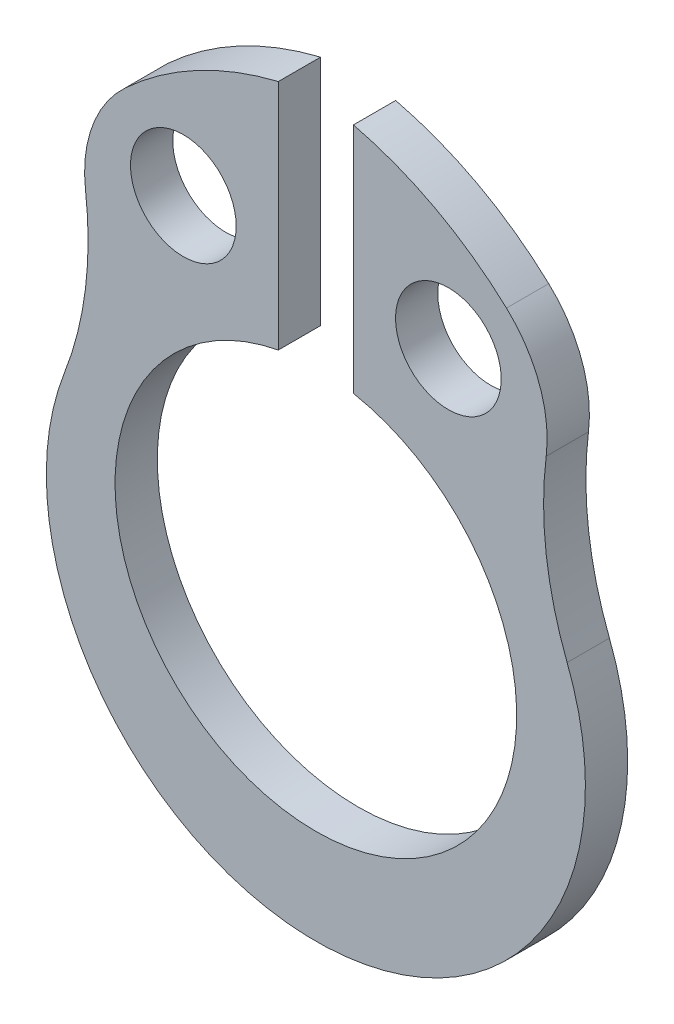
ISO-10303-21;
HEADER;
FILE_DESCRIPTION(('STEP AP214'),'2;1');
FILE_NAME('part.step','',(''),(''),'','','');
FILE_SCHEMA(('AUTOMOTIVE_DESIGN { 1 0 10303 214 1 1 1 1 }'));
ENDSEC;
DATA;
#1=APPLICATION_CONTEXT('core data for automotive mechanical design processes');
#2=APPLICATION_PROTOCOL_DEFINITION('international standard','automotive_design',2000,#1);
#3=PRODUCT_CONTEXT('',#1,'mechanical');
#4=PRODUCT('Part','Part','',(#3));
#5=PRODUCT_RELATED_PRODUCT_CATEGORY('part','',(#4));
#6=PRODUCT_DEFINITION_FORMATION('','',#4);
#7=PRODUCT_DEFINITION_CONTEXT('part definition',#1,'design');
#8=PRODUCT_DEFINITION('design','',#6,#7);
#9=PRODUCT_DEFINITION_SHAPE('','',#8);
#10=(LENGTH_UNIT() NAMED_UNIT(*) SI_UNIT(.MILLI.,.METRE.));
#11=(NAMED_UNIT(*) PLANE_ANGLE_UNIT() SI_UNIT($,.RADIAN.));
#12=(NAMED_UNIT(*) SI_UNIT($,.STERADIAN.) SOLID_ANGLE_UNIT());
#13=UNCERTAINTY_MEASURE_WITH_UNIT(LENGTH_MEASURE(1.E-05),#10,'distance_accuracy_value','');
#14=(GEOMETRIC_REPRESENTATION_CONTEXT(3) GLOBAL_UNCERTAINTY_ASSIGNED_CONTEXT((#13)) GLOBAL_UNIT_ASSIGNED_CONTEXT((#10,
#11,#12)) REPRESENTATION_CONTEXT('',''));
#15=CARTESIAN_POINT('',(0.,0.,0.));
#16=DIRECTION('',(0.,0.,1.));
#17=DIRECTION('',(1.,0.,0.));
#18=AXIS2_PLACEMENT_3D('',#15,#16,#17);
#19=CARTESIAN_POINT('',(-0.414589589053333,0.892839871271795,0.2));
#20=DIRECTION('',(0.,0.,-1.));
#21=DIRECTION('',(-1.,0.,0.));
#22=AXIS2_PLACEMENT_3D('',#19,#20,#21);
#23=PLANE('',#22);
#24=CARTESIAN_POINT('',(-0.414589589053333,0.892839871271795,0.2));
#25=DIRECTION('',(0.,0.,1.));
#26=DIRECTION('',(-1.,0.,0.));
#27=AXIS2_PLACEMENT_3D('',#24,#25,#26);
#28=CIRCLE('',#27,3.26568603204113);
#29=CARTESIAN_POINT('',(1.80338404953109,3.28977503902522,0.2));
#30=VERTEX_POINT('',#29);
#31=CARTESIAN_POINT('',(0.355177162860174,4.066507214822,0.2));
#32=VERTEX_POINT('',#31);
#33=EDGE_CURVE('E163',#30,#32,#28,.T.);
#34=ORIENTED_EDGE('',*,*,#33,.T.);
#35=DIRECTION('',(0.,-1.,0.));
#36=VECTOR('',#35,1.);
#37=CARTESIAN_POINT('',(0.355177162860174,4.066507214822,0.2));
#38=LINE('',#37,#36);
#39=CARTESIAN_POINT('',(0.355177162860174,1.866507214822,0.2));
#40=VERTEX_POINT('',#39);
#41=EDGE_CURVE('E101',#32,#40,#38,.T.);
#42=ORIENTED_EDGE('',*,*,#41,.T.);
#43=CARTESIAN_POINT('',(0.,0.,0.2));
#44=DIRECTION('',(0.,0.,-1.));
#45=DIRECTION('',(1.,0.,0.));
#46=AXIS2_PLACEMENT_3D('',#43,#44,#45);
#47=CIRCLE('',#46,1.9);
#48=CARTESIAN_POINT('',(-0.355177162860174,1.866507214822,0.2));
#49=VERTEX_POINT('',#48);
#50=EDGE_CURVE('E184',#40,#49,#47,.T.);
#51=ORIENTED_EDGE('',*,*,#50,.T.);
#52=DIRECTION('',(0.,1.,0.));
#53=VECTOR('',#52,1.);
#54=CARTESIAN_POINT('',(-0.355177162860174,4.066507214822,0.2));
#55=LINE('',#54,#53);
#56=CARTESIAN_POINT('',(-0.355177162860174,4.066507214822,0.2));
#57=VERTEX_POINT('',#56);
#58=EDGE_CURVE('E203',#49,#57,#55,.T.);
#59=ORIENTED_EDGE('',*,*,#58,.T.);
#60=CARTESIAN_POINT('',(0.414589589060315,0.892839871271795,0.2));
#61=DIRECTION('',(0.,0.,1.));
#62=DIRECTION('',(1.,0.,0.));
#63=AXIS2_PLACEMENT_3D('',#60,#61,#62);
#64=CIRCLE('',#63,3.26568603204195);
#65=CARTESIAN_POINT('',(-1.80338404952466,3.28977503902582,0.2));
#66=VERTEX_POINT('',#65);
#67=EDGE_CURVE('E200',#57,#66,#64,.T.);
#68=ORIENTED_EDGE('',*,*,#67,.T.);
#69=CARTESIAN_POINT('',(-0.98906064981131,2.40974636747533,0.2));
#70=DIRECTION('',(0.,0.,1.));
#71=DIRECTION('',(1.,0.,0.));
#72=AXIS2_PLACEMENT_3D('',#69,#70,#71);
#73=CIRCLE('',#72,1.19898834943033);
#74=CARTESIAN_POINT('',(-2.17908467622791,2.26340471714679,0.2));
#75=VERTEX_POINT('',#74);
#76=EDGE_CURVE('E202',#66,#75,#73,.T.);
#77=ORIENTED_EDGE('',*,*,#76,.T.);
#78=CARTESIAN_POINT('',(-5.44214854728816,1.86213369957221,0.2));
#79=DIRECTION('',(0.,0.,-1.));
#80=DIRECTION('',(-1.,0.,0.));
#81=AXIS2_PLACEMENT_3D('',#78,#79,#80);
#82=CIRCLE('',#81,3.28764418028533);
#83=CARTESIAN_POINT('',(-2.37723957935828,0.672622340035446,0.2));
#84=VERTEX_POINT('',#83);
#85=EDGE_CURVE('E126',#75,#84,#82,.T.);
#86=ORIENTED_EDGE('',*,*,#85,.T.);
#87=CARTESIAN_POINT('',(0.,-0.25,0.2));
#88=DIRECTION('',(0.,0.,1.));
#89=DIRECTION('',(1.,0.,0.));
#90=AXIS2_PLACEMENT_3D('',#87,#88,#89);
#91=CIRCLE('',#90,2.55);
#92=CARTESIAN_POINT('',(2.37723957935828,0.672622340035446,0.2));
#93=VERTEX_POINT('',#92);
#94=EDGE_CURVE('E120',#84,#93,#91,.T.);
#95=ORIENTED_EDGE('',*,*,#94,.T.);
#96=CARTESIAN_POINT('',(5.44214854728816,1.86213369957221,0.2));
#97=DIRECTION('',(0.,0.,-1.));
#98=DIRECTION('',(1.,0.,0.));
#99=AXIS2_PLACEMENT_3D('',#96,#97,#98);
#100=CIRCLE('',#99,3.28764418028186);
#101=CARTESIAN_POINT('',(2.17908467623146,2.26340471714721,0.2));
#102=VERTEX_POINT('',#101);
#103=EDGE_CURVE('E124',#93,#102,#100,.T.);
#104=ORIENTED_EDGE('',*,*,#103,.T.);
#105=CARTESIAN_POINT('',(0.989060649818293,2.40974636747533,0.2));
#106=DIRECTION('',(0.,0.,1.));
#107=DIRECTION('',(-1.,0.,0.));
#108=AXIS2_PLACEMENT_3D('',#105,#106,#107);
#109=CIRCLE('',#108,1.19898834943033);
#110=EDGE_CURVE('E52',#102,#30,#109,.T.);
#111=ORIENTED_EDGE('',*,*,#110,.T.);
#112=EDGE_LOOP('',(#34,#42,#51,#59,#68,#77,#86,#95,#104,#111));
#113=FACE_BOUND('',#112,.T.);
#114=CARTESIAN_POINT('',(-1.25367320500997,2.68221999934888,0.2));
#115=DIRECTION('',(0.,0.,1.));
#116=DIRECTION('',(1.,0.,0.));
#117=AXIS2_PLACEMENT_3D('',#114,#115,#116);
#118=CIRCLE('',#117,0.5);
#119=CARTESIAN_POINT('',(-0.753673205009974,2.68221999934888,0.2));
#120=VERTEX_POINT('',#119);
#121=EDGE_CURVE('E148',#120,#120,#118,.T.);
#122=ORIENTED_EDGE('',*,*,#121,.F.);
#123=EDGE_LOOP('',(#122));
#124=FACE_BOUND('',#123,.T.);
#125=CARTESIAN_POINT('',(1.25367320501696,2.68221999934888,0.2));
#126=DIRECTION('',(0.,0.,1.));
#127=DIRECTION('',(-1.,0.,0.));
#128=AXIS2_PLACEMENT_3D('',#125,#126,#127);
#129=CIRCLE('',#128,0.5);
#130=CARTESIAN_POINT('',(0.753673205016958,2.68221999934888,0.2));
#131=VERTEX_POINT('',#130);
#132=EDGE_CURVE('E214',#131,#131,#129,.T.);
#133=ORIENTED_EDGE('',*,*,#132,.F.);
#134=EDGE_LOOP('',(#133));
#135=FACE_BOUND('',#134,.T.);
#136=ADVANCED_FACE('F35',(#113,#124,#135),#23,.F.);
#137=CARTESIAN_POINT('',(-0.414589589053333,0.892839871271795,-0.2));
#138=DIRECTION('',(0.,0.,-1.));
#139=DIRECTION('',(-1.,0.,0.));
#140=AXIS2_PLACEMENT_3D('',#137,#138,#139);
#141=PLANE('',#140);
#142=CARTESIAN_POINT('',(-1.25367320500997,2.68221999934888,-0.2));
#143=DIRECTION('',(0.,0.,1.));
#144=DIRECTION('',(1.,0.,0.));
#145=AXIS2_PLACEMENT_3D('',#142,#143,#144);
#146=CIRCLE('',#145,0.5);
#147=CARTESIAN_POINT('',(-0.753673205009974,2.68221999934888,-0.2));
#148=VERTEX_POINT('',#147);
#149=EDGE_CURVE('E211',#148,#148,#146,.T.);
#150=ORIENTED_EDGE('',*,*,#149,.T.);
#151=EDGE_LOOP('',(#150));
#152=FACE_BOUND('',#151,.T.);
#153=CARTESIAN_POINT('',(-0.414589589053333,0.892839871271795,-0.2));
#154=DIRECTION('',(0.,0.,1.));
#155=DIRECTION('',(-1.,0.,0.));
#156=AXIS2_PLACEMENT_3D('',#153,#154,#155);
#157=CIRCLE('',#156,3.26568603204113);
#158=CARTESIAN_POINT('',(1.80338404953109,3.28977503902522,-0.2));
#159=VERTEX_POINT('',#158);
#160=CARTESIAN_POINT('',(0.355177162860174,4.066507214822,-0.2));
#161=VERTEX_POINT('',#160);
#162=EDGE_CURVE('E144',#159,#161,#157,.T.);
#163=ORIENTED_EDGE('',*,*,#162,.F.);
#164=CARTESIAN_POINT('',(0.989060649818293,2.40974636747533,-0.2));
#165=DIRECTION('',(0.,0.,1.));
#166=DIRECTION('',(-1.,0.,0.));
#167=AXIS2_PLACEMENT_3D('',#164,#165,#166);
#168=CIRCLE('',#167,1.19898834943033);
#169=CARTESIAN_POINT('',(2.17908467623146,2.26340471714721,-0.2));
#170=VERTEX_POINT('',#169);
#171=EDGE_CURVE('E93',#170,#159,#168,.T.);
#172=ORIENTED_EDGE('',*,*,#171,.F.);
#173=CARTESIAN_POINT('',(5.44214854728816,1.86213369957221,-0.2));
#174=DIRECTION('',(0.,0.,-1.));
#175=DIRECTION('',(1.,0.,0.));
#176=AXIS2_PLACEMENT_3D('',#173,#174,#175);
#177=CIRCLE('',#176,3.28764418028186);
#178=CARTESIAN_POINT('',(2.37723957935828,0.672622340035446,-0.2));
#179=VERTEX_POINT('',#178);
#180=EDGE_CURVE('E87',#179,#170,#177,.T.);
#181=ORIENTED_EDGE('',*,*,#180,.F.);
#182=CARTESIAN_POINT('',(0.,-0.25,-0.2));
#183=DIRECTION('',(0.,0.,1.));
#184=DIRECTION('',(1.,0.,0.));
#185=AXIS2_PLACEMENT_3D('',#182,#183,#184);
#186=CIRCLE('',#185,2.55);
#187=CARTESIAN_POINT('',(-2.37723957935828,0.672622340035446,-0.2));
#188=VERTEX_POINT('',#187);
#189=EDGE_CURVE('E134',#188,#179,#186,.T.);
#190=ORIENTED_EDGE('',*,*,#189,.F.);
#191=CARTESIAN_POINT('',(-5.44214854728816,1.86213369957221,-0.2));
#192=DIRECTION('',(0.,0.,-1.));
#193=DIRECTION('',(-1.,0.,0.));
#194=AXIS2_PLACEMENT_3D('',#191,#192,#193);
#195=CIRCLE('',#194,3.28764418028533);
#196=CARTESIAN_POINT('',(-2.17908467622791,2.26340471714679,-0.2));
#197=VERTEX_POINT('',#196);
#198=EDGE_CURVE('E158',#197,#188,#195,.T.);
#199=ORIENTED_EDGE('',*,*,#198,.F.);
#200=CARTESIAN_POINT('',(-0.98906064981131,2.40974636747533,-0.2));
#201=DIRECTION('',(0.,0.,1.));
#202=DIRECTION('',(1.,0.,0.));
#203=AXIS2_PLACEMENT_3D('',#200,#201,#202);
#204=CIRCLE('',#203,1.19898834943033);
#205=CARTESIAN_POINT('',(-1.80338404952466,3.28977503902582,-0.2));
#206=VERTEX_POINT('',#205);
#207=EDGE_CURVE('E156',#206,#197,#204,.T.);
#208=ORIENTED_EDGE('',*,*,#207,.F.);
#209=CARTESIAN_POINT('',(0.414589589060315,0.892839871271795,-0.2));
#210=DIRECTION('',(0.,0.,1.));
#211=DIRECTION('',(1.,0.,0.));
#212=AXIS2_PLACEMENT_3D('',#209,#210,#211);
#213=CIRCLE('',#212,3.26568603204195);
#214=CARTESIAN_POINT('',(-0.355177162860174,4.066507214822,-0.2));
#215=VERTEX_POINT('',#214);
#216=EDGE_CURVE('E154',#215,#206,#213,.T.);
#217=ORIENTED_EDGE('',*,*,#216,.F.);
#218=DIRECTION('',(0.,1.,0.));
#219=VECTOR('',#218,1.);
#220=CARTESIAN_POINT('',(-0.355177162860174,4.066507214822,-0.2));
#221=LINE('',#220,#219);
#222=CARTESIAN_POINT('',(-0.355177162860174,1.866507214822,-0.2));
#223=VERTEX_POINT('',#222);
#224=EDGE_CURVE('E152',#223,#215,#221,.T.);
#225=ORIENTED_EDGE('',*,*,#224,.F.);
#226=CARTESIAN_POINT('',(0.,0.,-0.2));
#227=DIRECTION('',(0.,0.,-1.));
#228=DIRECTION('',(1.,0.,0.));
#229=AXIS2_PLACEMENT_3D('',#226,#227,#228);
#230=CIRCLE('',#229,1.9);
#231=CARTESIAN_POINT('',(0.355177162860174,1.866507214822,-0.2));
#232=VERTEX_POINT('',#231);
#233=EDGE_CURVE('E150',#232,#223,#230,.T.);
#234=ORIENTED_EDGE('',*,*,#233,.F.);
#235=DIRECTION('',(0.,-1.,0.));
#236=VECTOR('',#235,1.);
#237=CARTESIAN_POINT('',(0.355177162860174,4.066507214822,-0.2));
#238=LINE('',#237,#236);
#239=EDGE_CURVE('E147',#161,#232,#238,.T.);
#240=ORIENTED_EDGE('',*,*,#239,.F.);
#241=EDGE_LOOP('',(#163,#172,#181,#190,#199,#208,#217,#225,#234,#240));
#242=FACE_BOUND('',#241,.T.);
#243=CARTESIAN_POINT('',(1.25367320501696,2.68221999934888,-0.2));
#244=DIRECTION('',(0.,0.,1.));
#245=DIRECTION('',(-1.,0.,0.));
#246=AXIS2_PLACEMENT_3D('',#243,#244,#245);
#247=CIRCLE('',#246,0.5);
#248=CARTESIAN_POINT('',(0.753673205016958,2.68221999934888,-0.2));
#249=VERTEX_POINT('',#248);
#250=EDGE_CURVE('E217',#249,#249,#247,.T.);
#251=ORIENTED_EDGE('',*,*,#250,.T.);
#252=EDGE_LOOP('',(#251));
#253=FACE_BOUND('',#252,.T.);
#254=ADVANCED_FACE('F188',(#152,#242,#253),#141,.T.);
#255=CARTESIAN_POINT('',(-0.414589589053333,0.892839871271795,0.2));
#256=DIRECTION('',(0.,0.,-1.));
#257=DIRECTION('',(-1.,0.,0.));
#258=AXIS2_PLACEMENT_3D('',#255,#256,#257);
#259=CYLINDRICAL_SURFACE('',#258,3.26568603204113);
#260=ORIENTED_EDGE('',*,*,#162,.T.);
#261=DIRECTION('',(0.,0.,-1.));
#262=VECTOR('',#261,1.);
#263=CARTESIAN_POINT('',(0.355177162860174,4.066507214822,0.2));
#264=LINE('',#263,#262);
#265=EDGE_CURVE('E11',#32,#161,#264,.T.);
#266=ORIENTED_EDGE('',*,*,#265,.F.);
#267=ORIENTED_EDGE('',*,*,#33,.F.);
#268=DIRECTION('',(0.,0.,-1.));
#269=VECTOR('',#268,1.);
#270=CARTESIAN_POINT('',(1.80338404953109,3.28977503902522,0.2));
#271=LINE('',#270,#269);
#272=EDGE_CURVE('E140',#30,#159,#271,.T.);
#273=ORIENTED_EDGE('',*,*,#272,.T.);
#274=EDGE_LOOP('',(#260,#266,#267,#273));
#275=FACE_BOUND('',#274,.T.);
#276=ADVANCED_FACE('F37',(#275),#259,.T.);
#277=CARTESIAN_POINT('',(0.355177162860174,4.066507214822,0.2));
#278=DIRECTION('',(1.,0.,0.));
#279=DIRECTION('',(0.,1.,0.));
#280=AXIS2_PLACEMENT_3D('',#277,#278,#279);
#281=PLANE('',#280);
#282=ORIENTED_EDGE('',*,*,#239,.T.);
#283=DIRECTION('',(0.,0.,-1.));
#284=VECTOR('',#283,1.);
#285=CARTESIAN_POINT('',(0.355177162860174,1.866507214822,0.2));
#286=LINE('',#285,#284);
#287=EDGE_CURVE('E44',#40,#232,#286,.T.);
#288=ORIENTED_EDGE('',*,*,#287,.F.);
#289=ORIENTED_EDGE('',*,*,#41,.F.);
#290=ORIENTED_EDGE('',*,*,#265,.T.);
#291=EDGE_LOOP('',(#282,#288,#289,#290));
#292=FACE_BOUND('',#291,.T.);
#293=ADVANCED_FACE('F257',(#292),#281,.F.);
#294=CARTESIAN_POINT('',(0.,0.,0.2));
#295=DIRECTION('',(0.,0.,-1.));
#296=DIRECTION('',(-1.,0.,0.));
#297=AXIS2_PLACEMENT_3D('',#294,#295,#296);
#298=CYLINDRICAL_SURFACE('',#297,1.9);
#299=ORIENTED_EDGE('',*,*,#233,.T.);
#300=DIRECTION('',(0.,0.,-1.));
#301=VECTOR('',#300,1.);
#302=CARTESIAN_POINT('',(-0.355177162860174,1.866507214822,0.2));
#303=LINE('',#302,#301);
#304=EDGE_CURVE('E176',#49,#223,#303,.T.);
#305=ORIENTED_EDGE('',*,*,#304,.F.);
#306=ORIENTED_EDGE('',*,*,#50,.F.);
#307=ORIENTED_EDGE('',*,*,#287,.T.);
#308=EDGE_LOOP('',(#299,#305,#306,#307));
#309=FACE_BOUND('',#308,.T.);
#310=ADVANCED_FACE('F182',(#309),#298,.F.);
#311=CARTESIAN_POINT('',(-0.355177162860174,4.066507214822,0.2));
#312=DIRECTION('',(-1.,0.,0.));
#313=DIRECTION('',(0.,-1.,0.));
#314=AXIS2_PLACEMENT_3D('',#311,#312,#313);
#315=PLANE('',#314);
#316=ORIENTED_EDGE('',*,*,#224,.T.);
#317=DIRECTION('',(0.,0.,-1.));
#318=VECTOR('',#317,1.);
#319=CARTESIAN_POINT('',(-0.355177162860174,4.066507214822,0.2));
#320=LINE('',#319,#318);
#321=EDGE_CURVE('E173',#57,#215,#320,.T.);
#322=ORIENTED_EDGE('',*,*,#321,.F.);
#323=ORIENTED_EDGE('',*,*,#58,.F.);
#324=ORIENTED_EDGE('',*,*,#304,.T.);
#325=EDGE_LOOP('',(#316,#322,#323,#324));
#326=FACE_BOUND('',#325,.T.);
#327=ADVANCED_FACE('F194',(#326),#315,.F.);
#328=CARTESIAN_POINT('',(0.414589589060315,0.892839871271795,0.2));
#329=DIRECTION('',(0.,0.,-1.));
#330=DIRECTION('',(-1.,0.,0.));
#331=AXIS2_PLACEMENT_3D('',#328,#329,#330);
#332=CYLINDRICAL_SURFACE('',#331,3.26568603204195);
#333=ORIENTED_EDGE('',*,*,#216,.T.);
#334=DIRECTION('',(0.,0.,-1.));
#335=VECTOR('',#334,1.);
#336=CARTESIAN_POINT('',(-1.80338404952466,3.28977503902582,0.2));
#337=LINE('',#336,#335);
#338=EDGE_CURVE('E170',#66,#206,#337,.T.);
#339=ORIENTED_EDGE('',*,*,#338,.F.);
#340=ORIENTED_EDGE('',*,*,#67,.F.);
#341=ORIENTED_EDGE('',*,*,#321,.T.);
#342=EDGE_LOOP('',(#333,#339,#340,#341));
#343=FACE_BOUND('',#342,.T.);
#344=ADVANCED_FACE('F198',(#343),#332,.T.);
#345=CARTESIAN_POINT('',(-0.98906064981131,2.40974636747533,0.2));
#346=DIRECTION('',(0.,0.,-1.));
#347=DIRECTION('',(-1.,0.,0.));
#348=AXIS2_PLACEMENT_3D('',#345,#346,#347);
#349=CYLINDRICAL_SURFACE('',#348,1.19898834943033);
#350=ORIENTED_EDGE('',*,*,#207,.T.);
#351=DIRECTION('',(0.,0.,-1.));
#352=VECTOR('',#351,1.);
#353=CARTESIAN_POINT('',(-2.17908467622791,2.26340471714679,0.2));
#354=LINE('',#353,#352);
#355=EDGE_CURVE('E167',#75,#197,#354,.T.);
#356=ORIENTED_EDGE('',*,*,#355,.F.);
#357=ORIENTED_EDGE('',*,*,#76,.F.);
#358=ORIENTED_EDGE('',*,*,#338,.T.);
#359=EDGE_LOOP('',(#350,#356,#357,#358));
#360=FACE_BOUND('',#359,.T.);
#361=ADVANCED_FACE('F247',(#360),#349,.T.);
#362=CARTESIAN_POINT('',(-5.44214854728816,1.86213369957221,0.2));
#363=DIRECTION('',(0.,0.,-1.));
#364=DIRECTION('',(-1.,0.,0.));
#365=AXIS2_PLACEMENT_3D('',#362,#363,#364);
#366=CYLINDRICAL_SURFACE('',#365,3.28764418028533);
#367=ORIENTED_EDGE('',*,*,#198,.T.);
#368=DIRECTION('',(0.,0.,-1.));
#369=VECTOR('',#368,1.);
#370=CARTESIAN_POINT('',(-2.37723957935828,0.672622340035446,0.2));
#371=LINE('',#370,#369);
#372=EDGE_CURVE('E135',#84,#188,#371,.T.);
#373=ORIENTED_EDGE('',*,*,#372,.F.);
#374=ORIENTED_EDGE('',*,*,#85,.F.);
#375=ORIENTED_EDGE('',*,*,#355,.T.);
#376=EDGE_LOOP('',(#367,#373,#374,#375));
#377=FACE_BOUND('',#376,.T.);
#378=ADVANCED_FACE('F244',(#377),#366,.F.);
#379=CARTESIAN_POINT('',(0.,-0.25,0.2));
#380=DIRECTION('',(0.,0.,-1.));
#381=DIRECTION('',(-1.,0.,0.));
#382=AXIS2_PLACEMENT_3D('',#379,#380,#381);
#383=CYLINDRICAL_SURFACE('',#382,2.55);
#384=ORIENTED_EDGE('',*,*,#189,.T.);
#385=DIRECTION('',(0.,0.,-1.));
#386=VECTOR('',#385,1.);
#387=CARTESIAN_POINT('',(2.37723957935828,0.672622340035446,0.2));
#388=LINE('',#387,#386);
#389=EDGE_CURVE('E131',#93,#179,#388,.T.);
#390=ORIENTED_EDGE('',*,*,#389,.F.);
#391=ORIENTED_EDGE('',*,*,#94,.F.);
#392=ORIENTED_EDGE('',*,*,#372,.T.);
#393=EDGE_LOOP('',(#384,#390,#391,#392));
#394=FACE_BOUND('',#393,.T.);
#395=ADVANCED_FACE('F132',(#394),#383,.T.);
#396=CARTESIAN_POINT('',(5.44214854728816,1.86213369957221,0.2));
#397=DIRECTION('',(0.,0.,-1.));
#398=DIRECTION('',(-1.,0.,0.));
#399=AXIS2_PLACEMENT_3D('',#396,#397,#398);
#400=CYLINDRICAL_SURFACE('',#399,3.28764418028186);
#401=ORIENTED_EDGE('',*,*,#180,.T.);
#402=DIRECTION('',(0.,0.,-1.));
#403=VECTOR('',#402,1.);
#404=CARTESIAN_POINT('',(2.17908467623146,2.26340471714721,0.2));
#405=LINE('',#404,#403);
#406=EDGE_CURVE('E136',#102,#170,#405,.T.);
#407=ORIENTED_EDGE('',*,*,#406,.F.);
#408=ORIENTED_EDGE('',*,*,#103,.F.);
#409=ORIENTED_EDGE('',*,*,#389,.T.);
#410=EDGE_LOOP('',(#401,#407,#408,#409));
#411=FACE_BOUND('',#410,.T.);
#412=ADVANCED_FACE('F138',(#411),#400,.F.);
#413=CARTESIAN_POINT('',(0.989060649818293,2.40974636747533,0.2));
#414=DIRECTION('',(0.,0.,-1.));
#415=DIRECTION('',(-1.,0.,0.));
#416=AXIS2_PLACEMENT_3D('',#413,#414,#415);
#417=CYLINDRICAL_SURFACE('',#416,1.19898834943033);
#418=ORIENTED_EDGE('',*,*,#171,.T.);
#419=ORIENTED_EDGE('',*,*,#272,.F.);
#420=ORIENTED_EDGE('',*,*,#110,.F.);
#421=ORIENTED_EDGE('',*,*,#406,.T.);
#422=EDGE_LOOP('',(#418,#419,#420,#421));
#423=FACE_BOUND('',#422,.T.);
#424=ADVANCED_FACE('F237',(#423),#417,.T.);
#425=CARTESIAN_POINT('',(-1.25367320500997,2.68221999934888,0.2));
#426=DIRECTION('',(0.,0.,-1.));
#427=DIRECTION('',(-1.,0.,0.));
#428=AXIS2_PLACEMENT_3D('',#425,#426,#427);
#429=CYLINDRICAL_SURFACE('',#428,0.5);
#430=ORIENTED_EDGE('',*,*,#121,.T.);
#431=EDGE_LOOP('',(#430));
#432=FACE_BOUND('',#431,.T.);
#433=ORIENTED_EDGE('',*,*,#149,.F.);
#434=EDGE_LOOP('',(#433));
#435=FACE_BOUND('',#434,.T.);
#436=ADVANCED_FACE('F234',(#432,#435),#429,.F.);
#437=CARTESIAN_POINT('',(1.25367320501696,2.68221999934888,0.2));
#438=DIRECTION('',(0.,0.,-1.));
#439=DIRECTION('',(-1.,0.,0.));
#440=AXIS2_PLACEMENT_3D('',#437,#438,#439);
#441=CYLINDRICAL_SURFACE('',#440,0.5);
#442=ORIENTED_EDGE('',*,*,#132,.T.);
#443=EDGE_LOOP('',(#442));
#444=FACE_BOUND('',#443,.T.);
#445=ORIENTED_EDGE('',*,*,#250,.F.);
#446=EDGE_LOOP('',(#445));
#447=FACE_BOUND('',#446,.T.);
#448=ADVANCED_FACE('F223',(#444,#447),#441,.F.);
#449=CLOSED_SHELL('',(#136,#254,#276,#293,#310,#327,#344,#361,#378,#395,#412,#424,#436,#448));
#450=MANIFOLD_SOLID_BREP('B2',#449);
#451=ADVANCED_BREP_SHAPE_REPRESENTATION('',(#18,#450),#14);
#452=SHAPE_DEFINITION_REPRESENTATION(#9,#451);
ENDSEC;
END-ISO-10303-21;
